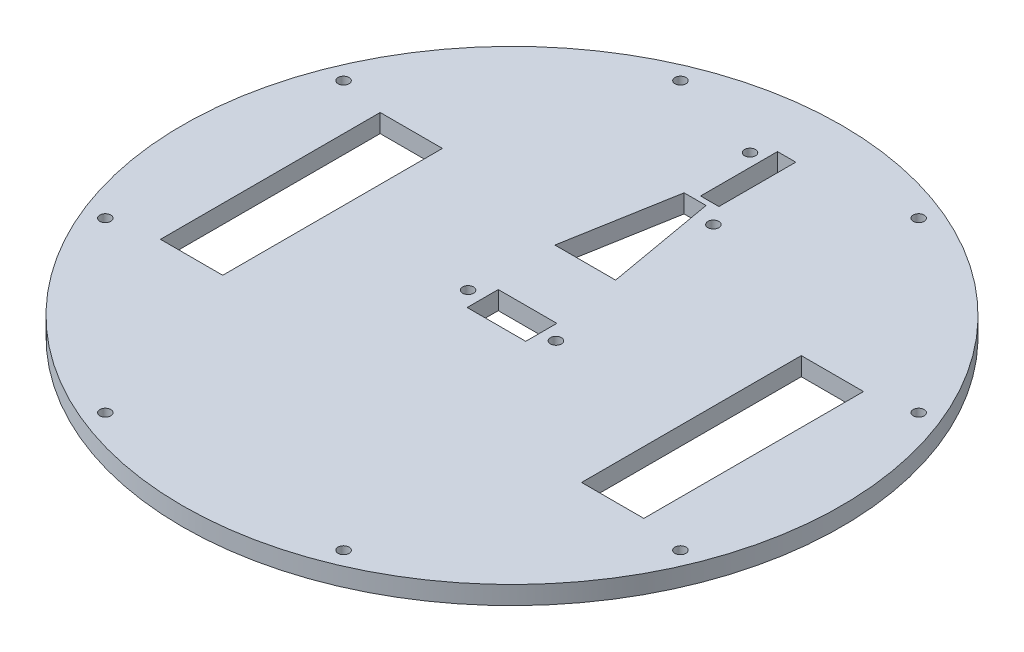
ISO-10303-21;
HEADER;
FILE_DESCRIPTION(('STEP AP214'),'2;1');
FILE_NAME('part.step','',(''),(''),'','','');
FILE_SCHEMA(('AUTOMOTIVE_DESIGN { 1 0 10303 214 1 1 1 1 }'));
ENDSEC;
DATA;
#1=APPLICATION_CONTEXT('core data for automotive mechanical design processes');
#2=APPLICATION_PROTOCOL_DEFINITION('international standard','automotive_design',2000,#1);
#3=PRODUCT_CONTEXT('',#1,'mechanical');
#4=PRODUCT('Part','Part','',(#3));
#5=PRODUCT_RELATED_PRODUCT_CATEGORY('part','',(#4));
#6=PRODUCT_DEFINITION_FORMATION('','',#4);
#7=PRODUCT_DEFINITION_CONTEXT('part definition',#1,'design');
#8=PRODUCT_DEFINITION('design','',#6,#7);
#9=PRODUCT_DEFINITION_SHAPE('','',#8);
#10=(LENGTH_UNIT() NAMED_UNIT(*) SI_UNIT(.MILLI.,.METRE.));
#11=(NAMED_UNIT(*) PLANE_ANGLE_UNIT() SI_UNIT($,.RADIAN.));
#12=(NAMED_UNIT(*) SI_UNIT($,.STERADIAN.) SOLID_ANGLE_UNIT());
#13=UNCERTAINTY_MEASURE_WITH_UNIT(LENGTH_MEASURE(1.E-05),#10,'distance_accuracy_value','');
#14=(GEOMETRIC_REPRESENTATION_CONTEXT(3) GLOBAL_UNCERTAINTY_ASSIGNED_CONTEXT((#13)) GLOBAL_UNIT_ASSIGNED_CONTEXT((#10,
#11,#12)) REPRESENTATION_CONTEXT('',''));
#15=CARTESIAN_POINT('',(0.,0.,0.));
#16=DIRECTION('',(0.,0.,1.));
#17=DIRECTION('',(1.,0.,0.));
#18=AXIS2_PLACEMENT_3D('',#15,#16,#17);
#19=CARTESIAN_POINT('',(0.,5.,0.));
#20=DIRECTION('',(0.,1.,0.));
#21=DIRECTION('',(0.,0.,1.));
#22=AXIS2_PLACEMENT_3D('',#19,#20,#21);
#23=PLANE('',#22);
#24=CARTESIAN_POINT('',(12.,5.,0.));
#25=DIRECTION('',(0.,1.,0.));
#26=DIRECTION('',(0.,0.,1.));
#27=AXIS2_PLACEMENT_3D('',#24,#25,#26);
#28=CIRCLE('',#27,1.5);
#29=CARTESIAN_POINT('',(12.,5.,1.5));
#30=VERTEX_POINT('',#29);
#31=EDGE_CURVE('E831',#30,#30,#28,.T.);
#32=ORIENTED_EDGE('',*,*,#31,.F.);
#33=EDGE_LOOP('',(#32));
#34=FACE_BOUND('',#33,.T.);
#35=CARTESIAN_POINT('',(-12.,5.,0.));
#36=DIRECTION('',(0.,1.,0.));
#37=DIRECTION('',(0.,0.,1.));
#38=AXIS2_PLACEMENT_3D('',#35,#36,#37);
#39=CIRCLE('',#38,1.5);
#40=CARTESIAN_POINT('',(-12.,5.,1.5));
#41=VERTEX_POINT('',#40);
#42=EDGE_CURVE('E829',#41,#41,#39,.T.);
#43=ORIENTED_EDGE('',*,*,#42,.F.);
#44=EDGE_LOOP('',(#43));
#45=FACE_BOUND('',#44,.T.);
#46=DIRECTION('',(0.,0.,-1.));
#47=VECTOR('',#46,1.);
#48=CARTESIAN_POINT('',(8.,5.,4.25));
#49=LINE('',#48,#47);
#50=CARTESIAN_POINT('',(8.,5.,4.25));
#51=VERTEX_POINT('',#50);
#52=CARTESIAN_POINT('',(8.,5.,-4.25));
#53=VERTEX_POINT('',#52);
#54=EDGE_CURVE('E52',#51,#53,#49,.T.);
#55=ORIENTED_EDGE('',*,*,#54,.F.);
#56=DIRECTION('',(1.,0.,0.));
#57=VECTOR('',#56,1.);
#58=CARTESIAN_POINT('',(-8.,5.,4.25));
#59=LINE('',#58,#57);
#60=CARTESIAN_POINT('',(-8.,5.,4.25));
#61=VERTEX_POINT('',#60);
#62=EDGE_CURVE('E192',#61,#51,#59,.T.);
#63=ORIENTED_EDGE('',*,*,#62,.F.);
#64=DIRECTION('',(0.,0.,1.));
#65=VECTOR('',#64,1.);
#66=CARTESIAN_POINT('',(-8.,5.,4.25));
#67=LINE('',#66,#65);
#68=CARTESIAN_POINT('',(-8.,5.,-4.25));
#69=VERTEX_POINT('',#68);
#70=EDGE_CURVE('E177',#69,#61,#67,.T.);
#71=ORIENTED_EDGE('',*,*,#70,.F.);
#72=DIRECTION('',(-1.,0.,0.));
#73=VECTOR('',#72,1.);
#74=CARTESIAN_POINT('',(-8.,5.,-4.25));
#75=LINE('',#74,#73);
#76=EDGE_CURVE('E186',#53,#69,#75,.T.);
#77=ORIENTED_EDGE('',*,*,#76,.F.);
#78=EDGE_LOOP('',(#55,#63,#71,#77));
#79=FACE_BOUND('',#78,.T.);
#80=CARTESIAN_POINT('',(78.5297602634595,5.,-32.5280917510323));
#81=DIRECTION('',(0.,1.,0.));
#82=DIRECTION('',(0.,0.,1.));
#83=AXIS2_PLACEMENT_3D('',#80,#81,#82);
#84=CIRCLE('',#83,1.5);
#85=CARTESIAN_POINT('',(78.5297602634595,5.,-31.0280917510323));
#86=VERTEX_POINT('',#85);
#87=EDGE_CURVE('E212',#86,#86,#84,.T.);
#88=ORIENTED_EDGE('',*,*,#87,.F.);
#89=EDGE_LOOP('',(#88));
#90=FACE_BOUND('',#89,.T.);
#91=CARTESIAN_POINT('',(78.5297602634593,5.,32.5280917510329));
#92=DIRECTION('',(0.,1.,0.));
#93=DIRECTION('',(0.,0.,1.));
#94=AXIS2_PLACEMENT_3D('',#91,#92,#93);
#95=CIRCLE('',#94,1.5);
#96=CARTESIAN_POINT('',(78.5297602634593,5.,34.0280917510329));
#97=VERTEX_POINT('',#96);
#98=EDGE_CURVE('E216',#97,#97,#95,.T.);
#99=ORIENTED_EDGE('',*,*,#98,.F.);
#100=EDGE_LOOP('',(#99));
#101=FACE_BOUND('',#100,.T.);
#102=CARTESIAN_POINT('',(32.5280917510323,5.,78.5297602634595));
#103=DIRECTION('',(0.,1.,0.));
#104=DIRECTION('',(0.,0.,1.));
#105=AXIS2_PLACEMENT_3D('',#102,#103,#104);
#106=CIRCLE('',#105,1.50000000000002);
#107=CARTESIAN_POINT('',(32.5280917510323,5.,80.0297602634595));
#108=VERTEX_POINT('',#107);
#109=EDGE_CURVE('E219',#108,#108,#106,.T.);
#110=ORIENTED_EDGE('',*,*,#109,.F.);
#111=EDGE_LOOP('',(#110));
#112=FACE_BOUND('',#111,.T.);
#113=CARTESIAN_POINT('',(-32.5280917510329,5.,78.5297602634593));
#114=DIRECTION('',(0.,1.,0.));
#115=DIRECTION('',(0.,0.,1.));
#116=AXIS2_PLACEMENT_3D('',#113,#114,#115);
#117=CIRCLE('',#116,1.5);
#118=CARTESIAN_POINT('',(-32.5280917510329,5.,80.0297602634593));
#119=VERTEX_POINT('',#118);
#120=EDGE_CURVE('E205',#119,#119,#117,.T.);
#121=ORIENTED_EDGE('',*,*,#120,.F.);
#122=EDGE_LOOP('',(#121));
#123=FACE_BOUND('',#122,.T.);
#124=CARTESIAN_POINT('',(-78.5297602634595,5.,32.5280917510323));
#125=DIRECTION('',(0.,1.,0.));
#126=DIRECTION('',(0.,0.,1.));
#127=AXIS2_PLACEMENT_3D('',#124,#125,#126);
#128=CIRCLE('',#127,1.5);
#129=CARTESIAN_POINT('',(-78.5297602634595,5.,34.0280917510323));
#130=VERTEX_POINT('',#129);
#131=EDGE_CURVE('E202',#130,#130,#128,.T.);
#132=ORIENTED_EDGE('',*,*,#131,.F.);
#133=EDGE_LOOP('',(#132));
#134=FACE_BOUND('',#133,.T.);
#135=CARTESIAN_POINT('',(-78.5297602634593,5.,-32.5280917510329));
#136=DIRECTION('',(0.,1.,0.));
#137=DIRECTION('',(0.,0.,1.));
#138=AXIS2_PLACEMENT_3D('',#135,#136,#137);
#139=CIRCLE('',#138,1.50000000000001);
#140=CARTESIAN_POINT('',(-78.5297602634593,5.,-31.0280917510329));
#141=VERTEX_POINT('',#140);
#142=EDGE_CURVE('E206',#141,#141,#139,.T.);
#143=ORIENTED_EDGE('',*,*,#142,.F.);
#144=EDGE_LOOP('',(#143));
#145=FACE_BOUND('',#144,.T.);
#146=CARTESIAN_POINT('',(-32.5280917510323,5.,-78.5297602634595));
#147=DIRECTION('',(0.,1.,0.));
#148=DIRECTION('',(0.,0.,1.));
#149=AXIS2_PLACEMENT_3D('',#146,#147,#148);
#150=CIRCLE('',#149,1.5);
#151=CARTESIAN_POINT('',(-32.5280917510323,5.,-77.0297602634595));
#152=VERTEX_POINT('',#151);
#153=EDGE_CURVE('E209',#152,#152,#150,.T.);
#154=ORIENTED_EDGE('',*,*,#153,.F.);
#155=EDGE_LOOP('',(#154));
#156=FACE_BOUND('',#155,.T.);
#157=CARTESIAN_POINT('',(32.528091751033,5.,-78.5297602634592));
#158=DIRECTION('',(0.,1.,0.));
#159=DIRECTION('',(0.,0.,1.));
#160=AXIS2_PLACEMENT_3D('',#157,#158,#159);
#161=CIRCLE('',#160,1.5);
#162=CARTESIAN_POINT('',(32.528091751033,5.,-77.0297602634592));
#163=VERTEX_POINT('',#162);
#164=EDGE_CURVE('E215',#163,#163,#161,.T.);
#165=ORIENTED_EDGE('',*,*,#164,.F.);
#166=EDGE_LOOP('',(#165));
#167=FACE_BOUND('',#166,.T.);
#168=CARTESIAN_POINT('',(-6.,5.,-71.));
#169=DIRECTION('',(0.,1.,0.));
#170=DIRECTION('',(0.,0.,1.));
#171=AXIS2_PLACEMENT_3D('',#168,#169,#170);
#172=CIRCLE('',#171,1.5);
#173=CARTESIAN_POINT('',(-6.,5.,-69.5));
#174=VERTEX_POINT('',#173);
#175=EDGE_CURVE('E266',#174,#174,#172,.T.);
#176=ORIENTED_EDGE('',*,*,#175,.F.);
#177=EDGE_LOOP('',(#176));
#178=FACE_BOUND('',#177,.T.);
#179=CARTESIAN_POINT('',(0.,5.,0.));
#180=DIRECTION('',(0.,1.,0.));
#181=DIRECTION('',(0.,0.,1.));
#182=AXIS2_PLACEMENT_3D('',#179,#180,#181);
#183=CIRCLE('',#182,90.);
#184=CARTESIAN_POINT('',(0.,5.,90.));
#185=VERTEX_POINT('',#184);
#186=EDGE_CURVE('E365',#185,#185,#183,.T.);
#187=ORIENTED_EDGE('',*,*,#186,.T.);
#188=EDGE_LOOP('',(#187));
#189=FACE_BOUND('',#188,.T.);
#190=DIRECTION('',(1.,0.,0.));
#191=VECTOR('',#190,1.);
#192=CARTESIAN_POINT('',(-49.,5.,30.));
#193=LINE('',#192,#191);
#194=CARTESIAN_POINT('',(-66.,5.,30.));
#195=VERTEX_POINT('',#194);
#196=CARTESIAN_POINT('',(-49.,5.,30.));
#197=VERTEX_POINT('',#196);
#198=EDGE_CURVE('E336',#195,#197,#193,.T.);
#199=ORIENTED_EDGE('',*,*,#198,.F.);
#200=DIRECTION('',(0.,0.,1.));
#201=VECTOR('',#200,1.);
#202=CARTESIAN_POINT('',(-66.,5.,30.));
#203=LINE('',#202,#201);
#204=CARTESIAN_POINT('',(-66.,5.,-30.));
#205=VERTEX_POINT('',#204);
#206=EDGE_CURVE('E334',#205,#195,#203,.T.);
#207=ORIENTED_EDGE('',*,*,#206,.F.);
#208=DIRECTION('',(-1.,0.,0.));
#209=VECTOR('',#208,1.);
#210=CARTESIAN_POINT('',(-49.,5.,-30.));
#211=LINE('',#210,#209);
#212=CARTESIAN_POINT('',(-49.,5.,-30.));
#213=VERTEX_POINT('',#212);
#214=EDGE_CURVE('E342',#213,#205,#211,.T.);
#215=ORIENTED_EDGE('',*,*,#214,.F.);
#216=DIRECTION('',(0.,0.,-1.));
#217=VECTOR('',#216,1.);
#218=CARTESIAN_POINT('',(-49.,5.,30.));
#219=LINE('',#218,#217);
#220=EDGE_CURVE('E339',#197,#213,#219,.T.);
#221=ORIENTED_EDGE('',*,*,#220,.F.);
#222=EDGE_LOOP('',(#199,#207,#215,#221));
#223=FACE_BOUND('',#222,.T.);
#224=DIRECTION('',(1.,0.,0.));
#225=VECTOR('',#224,1.);
#226=CARTESIAN_POINT('',(49.,5.,30.));
#227=LINE('',#226,#225);
#228=CARTESIAN_POINT('',(49.,5.,30.));
#229=VERTEX_POINT('',#228);
#230=CARTESIAN_POINT('',(66.,5.,30.));
#231=VERTEX_POINT('',#230);
#232=EDGE_CURVE('E305',#229,#231,#227,.T.);
#233=ORIENTED_EDGE('',*,*,#232,.F.);
#234=DIRECTION('',(0.,0.,1.));
#235=VECTOR('',#234,1.);
#236=CARTESIAN_POINT('',(49.,5.,30.));
#237=LINE('',#236,#235);
#238=CARTESIAN_POINT('',(49.,5.,-30.));
#239=VERTEX_POINT('',#238);
#240=EDGE_CURVE('E303',#239,#229,#237,.T.);
#241=ORIENTED_EDGE('',*,*,#240,.F.);
#242=DIRECTION('',(-1.,0.,0.));
#243=VECTOR('',#242,1.);
#244=CARTESIAN_POINT('',(49.,5.,-30.));
#245=LINE('',#244,#243);
#246=CARTESIAN_POINT('',(66.,5.,-30.));
#247=VERTEX_POINT('',#246);
#248=EDGE_CURVE('E311',#247,#239,#245,.T.);
#249=ORIENTED_EDGE('',*,*,#248,.F.);
#250=DIRECTION('',(0.,0.,-1.));
#251=VECTOR('',#250,1.);
#252=CARTESIAN_POINT('',(66.,5.,30.));
#253=LINE('',#252,#251);
#254=EDGE_CURVE('E308',#231,#247,#253,.T.);
#255=ORIENTED_EDGE('',*,*,#254,.F.);
#256=EDGE_LOOP('',(#233,#241,#249,#255));
#257=FACE_BOUND('',#256,.T.);
#258=DIRECTION('',(-1.,0.,0.));
#259=VECTOR('',#258,1.);
#260=CARTESIAN_POINT('',(-2.5,5.,-75.));
#261=LINE('',#260,#259);
#262=CARTESIAN_POINT('',(2.5,5.,-75.));
#263=VERTEX_POINT('',#262);
#264=CARTESIAN_POINT('',(-2.5,5.,-75.));
#265=VERTEX_POINT('',#264);
#266=EDGE_CURVE('E274',#263,#265,#261,.T.);
#267=ORIENTED_EDGE('',*,*,#266,.F.);
#268=DIRECTION('',(0.,0.,-1.));
#269=VECTOR('',#268,1.);
#270=CARTESIAN_POINT('',(2.5,5.,-54.));
#271=LINE('',#270,#269);
#272=CARTESIAN_POINT('',(2.5,5.,-54.));
#273=VERTEX_POINT('',#272);
#274=EDGE_CURVE('E272',#273,#263,#271,.T.);
#275=ORIENTED_EDGE('',*,*,#274,.F.);
#276=DIRECTION('',(1.,0.,0.));
#277=VECTOR('',#276,1.);
#278=CARTESIAN_POINT('',(-2.5,5.,-54.));
#279=LINE('',#278,#277);
#280=CARTESIAN_POINT('',(-2.5,5.,-54.));
#281=VERTEX_POINT('',#280);
#282=EDGE_CURVE('E280',#281,#273,#279,.T.);
#283=ORIENTED_EDGE('',*,*,#282,.F.);
#284=DIRECTION('',(0.,0.,1.));
#285=VECTOR('',#284,1.);
#286=CARTESIAN_POINT('',(-2.5,5.,-54.));
#287=LINE('',#286,#285);
#288=EDGE_CURVE('E277',#265,#281,#287,.T.);
#289=ORIENTED_EDGE('',*,*,#288,.F.);
#290=EDGE_LOOP('',(#267,#275,#283,#289));
#291=FACE_BOUND('',#290,.T.);
#292=CARTESIAN_POINT('',(6.00000000000001,5.,-49.));
#293=DIRECTION('',(0.,1.,0.));
#294=DIRECTION('',(0.,0.,1.));
#295=AXIS2_PLACEMENT_3D('',#292,#293,#294);
#296=CIRCLE('',#295,1.5);
#297=CARTESIAN_POINT('',(6.00000000000001,5.,-47.5));
#298=VERTEX_POINT('',#297);
#299=EDGE_CURVE('E260',#298,#298,#296,.T.);
#300=ORIENTED_EDGE('',*,*,#299,.F.);
#301=EDGE_LOOP('',(#300));
#302=FACE_BOUND('',#301,.T.);
#303=DIRECTION('',(-1.,0.,0.));
#304=VECTOR('',#303,1.);
#305=CARTESIAN_POINT('',(-5.49999999999999,5.,-52.5));
#306=LINE('',#305,#304);
#307=CARTESIAN_POINT('',(0.500000000000005,5.,-52.5));
#308=VERTEX_POINT('',#307);
#309=CARTESIAN_POINT('',(-5.49999999999999,5.,-52.5));
#310=VERTEX_POINT('',#309);
#311=EDGE_CURVE('E229',#308,#310,#306,.T.);
#312=ORIENTED_EDGE('',*,*,#311,.F.);
#313=DIRECTION('',(-0.173648177666931,0.,-0.984807753012208));
#314=VECTOR('',#313,1.);
#315=CARTESIAN_POINT('',(0.500000000000005,5.,-52.5));
#316=LINE('',#315,#314);
#317=CARTESIAN_POINT('',(5.78980942125399,5.,-22.5));
#318=VERTEX_POINT('',#317);
#319=EDGE_CURVE('E227',#318,#308,#316,.T.);
#320=ORIENTED_EDGE('',*,*,#319,.F.);
#321=DIRECTION('',(1.,0.,0.));
#322=VECTOR('',#321,1.);
#323=CARTESIAN_POINT('',(5.78980942125399,5.,-22.5));
#324=LINE('',#323,#322);
#325=CARTESIAN_POINT('',(-10.789809421254,5.,-22.5));
#326=VERTEX_POINT('',#325);
#327=EDGE_CURVE('E235',#326,#318,#324,.T.);
#328=ORIENTED_EDGE('',*,*,#327,.F.);
#329=DIRECTION('',(-0.173648177666931,0.,0.984807753012208));
#330=VECTOR('',#329,1.);
#331=CARTESIAN_POINT('',(-5.49999999999999,5.,-52.5));
#332=LINE('',#331,#330);
#333=EDGE_CURVE('E232',#310,#326,#332,.T.);
#334=ORIENTED_EDGE('',*,*,#333,.F.);
#335=EDGE_LOOP('',(#312,#320,#328,#334));
#336=FACE_BOUND('',#335,.T.);
#337=ADVANCED_FACE('F35',(#34,#45,#79,#90,#101,#112,#123,#134,#145,#156,#167,#178,#189,#223,
#257,#291,#302,#336),#23,.T.);
#338=CARTESIAN_POINT('',(0.,0.,0.));
#339=DIRECTION('',(0.,1.,0.));
#340=DIRECTION('',(0.,0.,1.));
#341=AXIS2_PLACEMENT_3D('',#338,#339,#340);
#342=PLANE('',#341);
#343=CARTESIAN_POINT('',(12.,0.,0.));
#344=DIRECTION('',(0.,1.,0.));
#345=DIRECTION('',(0.,0.,1.));
#346=AXIS2_PLACEMENT_3D('',#343,#344,#345);
#347=CIRCLE('',#346,1.5);
#348=CARTESIAN_POINT('',(12.,0.,1.5));
#349=VERTEX_POINT('',#348);
#350=EDGE_CURVE('E39',#349,#349,#347,.T.);
#351=ORIENTED_EDGE('',*,*,#350,.T.);
#352=EDGE_LOOP('',(#351));
#353=FACE_BOUND('',#352,.T.);
#354=CARTESIAN_POINT('',(-12.,0.,0.));
#355=DIRECTION('',(0.,1.,0.));
#356=DIRECTION('',(0.,0.,1.));
#357=AXIS2_PLACEMENT_3D('',#354,#355,#356);
#358=CIRCLE('',#357,1.5);
#359=CARTESIAN_POINT('',(-12.,0.,1.5));
#360=VERTEX_POINT('',#359);
#361=EDGE_CURVE('E199',#360,#360,#358,.T.);
#362=ORIENTED_EDGE('',*,*,#361,.T.);
#363=EDGE_LOOP('',(#362));
#364=FACE_BOUND('',#363,.T.);
#365=DIRECTION('',(1.,0.,0.));
#366=VECTOR('',#365,1.);
#367=CARTESIAN_POINT('',(0.,0.,4.25));
#368=LINE('',#367,#366);
#369=CARTESIAN_POINT('',(-8.,0.,4.25));
#370=VERTEX_POINT('',#369);
#371=CARTESIAN_POINT('',(8.,0.,4.25));
#372=VERTEX_POINT('',#371);
#373=EDGE_CURVE('E44',#370,#372,#368,.T.);
#374=ORIENTED_EDGE('',*,*,#373,.T.);
#375=DIRECTION('',(0.,0.,-1.));
#376=VECTOR('',#375,1.);
#377=CARTESIAN_POINT('',(8.,0.,0.));
#378=LINE('',#377,#376);
#379=CARTESIAN_POINT('',(8.,0.,-4.25));
#380=VERTEX_POINT('',#379);
#381=EDGE_CURVE('E11',#372,#380,#378,.T.);
#382=ORIENTED_EDGE('',*,*,#381,.T.);
#383=DIRECTION('',(-1.,0.,0.));
#384=VECTOR('',#383,1.);
#385=CARTESIAN_POINT('',(0.,0.,-4.25));
#386=LINE('',#385,#384);
#387=CARTESIAN_POINT('',(-8.,0.,-4.25));
#388=VERTEX_POINT('',#387);
#389=EDGE_CURVE('E368',#380,#388,#386,.T.);
#390=ORIENTED_EDGE('',*,*,#389,.T.);
#391=DIRECTION('',(0.,0.,1.));
#392=VECTOR('',#391,1.);
#393=CARTESIAN_POINT('',(-8.,0.,0.));
#394=LINE('',#393,#392);
#395=EDGE_CURVE('E180',#388,#370,#394,.T.);
#396=ORIENTED_EDGE('',*,*,#395,.T.);
#397=EDGE_LOOP('',(#374,#382,#390,#396));
#398=FACE_BOUND('',#397,.T.);
#399=CARTESIAN_POINT('',(78.5297602634595,0.,-32.5280917510323));
#400=DIRECTION('',(0.,1.,0.));
#401=DIRECTION('',(0.,0.,1.));
#402=AXIS2_PLACEMENT_3D('',#399,#400,#401);
#403=CIRCLE('',#402,1.5);
#404=CARTESIAN_POINT('',(78.5297602634595,0.,-31.0280917510323));
#405=VERTEX_POINT('',#404);
#406=EDGE_CURVE('E242',#405,#405,#403,.T.);
#407=ORIENTED_EDGE('',*,*,#406,.T.);
#408=EDGE_LOOP('',(#407));
#409=FACE_BOUND('',#408,.T.);
#410=CARTESIAN_POINT('',(78.5297602634593,0.,32.5280917510329));
#411=DIRECTION('',(0.,1.,0.));
#412=DIRECTION('',(0.,0.,1.));
#413=AXIS2_PLACEMENT_3D('',#410,#411,#412);
#414=CIRCLE('',#413,1.5);
#415=CARTESIAN_POINT('',(78.5297602634593,0.,34.0280917510329));
#416=VERTEX_POINT('',#415);
#417=EDGE_CURVE('E388',#416,#416,#414,.T.);
#418=ORIENTED_EDGE('',*,*,#417,.T.);
#419=EDGE_LOOP('',(#418));
#420=FACE_BOUND('',#419,.T.);
#421=CARTESIAN_POINT('',(32.5280917510323,0.,78.5297602634595));
#422=DIRECTION('',(0.,1.,0.));
#423=DIRECTION('',(0.,0.,1.));
#424=AXIS2_PLACEMENT_3D('',#421,#422,#423);
#425=CIRCLE('',#424,1.50000000000002);
#426=CARTESIAN_POINT('',(32.5280917510323,0.,80.0297602634595));
#427=VERTEX_POINT('',#426);
#428=EDGE_CURVE('E385',#427,#427,#425,.T.);
#429=ORIENTED_EDGE('',*,*,#428,.T.);
#430=EDGE_LOOP('',(#429));
#431=FACE_BOUND('',#430,.T.);
#432=CARTESIAN_POINT('',(-32.5280917510329,0.,78.5297602634593));
#433=DIRECTION('',(0.,1.,0.));
#434=DIRECTION('',(0.,0.,1.));
#435=AXIS2_PLACEMENT_3D('',#432,#433,#434);
#436=CIRCLE('',#435,1.5);
#437=CARTESIAN_POINT('',(-32.5280917510329,0.,80.0297602634593));
#438=VERTEX_POINT('',#437);
#439=EDGE_CURVE('E382',#438,#438,#436,.T.);
#440=ORIENTED_EDGE('',*,*,#439,.T.);
#441=EDGE_LOOP('',(#440));
#442=FACE_BOUND('',#441,.T.);
#443=CARTESIAN_POINT('',(-78.5297602634595,0.,32.5280917510323));
#444=DIRECTION('',(0.,1.,0.));
#445=DIRECTION('',(0.,0.,1.));
#446=AXIS2_PLACEMENT_3D('',#443,#444,#445);
#447=CIRCLE('',#446,1.5);
#448=CARTESIAN_POINT('',(-78.5297602634595,0.,34.0280917510323));
#449=VERTEX_POINT('',#448);
#450=EDGE_CURVE('E379',#449,#449,#447,.T.);
#451=ORIENTED_EDGE('',*,*,#450,.T.);
#452=EDGE_LOOP('',(#451));
#453=FACE_BOUND('',#452,.T.);
#454=CARTESIAN_POINT('',(-78.5297602634593,0.,-32.5280917510329));
#455=DIRECTION('',(0.,1.,0.));
#456=DIRECTION('',(0.,0.,1.));
#457=AXIS2_PLACEMENT_3D('',#454,#455,#456);
#458=CIRCLE('',#457,1.50000000000001);
#459=CARTESIAN_POINT('',(-78.5297602634593,0.,-31.0280917510329));
#460=VERTEX_POINT('',#459);
#461=EDGE_CURVE('E376',#460,#460,#458,.T.);
#462=ORIENTED_EDGE('',*,*,#461,.T.);
#463=EDGE_LOOP('',(#462));
#464=FACE_BOUND('',#463,.T.);
#465=CARTESIAN_POINT('',(-32.5280917510323,0.,-78.5297602634595));
#466=DIRECTION('',(0.,1.,0.));
#467=DIRECTION('',(0.,0.,1.));
#468=AXIS2_PLACEMENT_3D('',#465,#466,#467);
#469=CIRCLE('',#468,1.5);
#470=CARTESIAN_POINT('',(-32.5280917510323,0.,-77.0297602634595));
#471=VERTEX_POINT('',#470);
#472=EDGE_CURVE('E373',#471,#471,#469,.T.);
#473=ORIENTED_EDGE('',*,*,#472,.T.);
#474=EDGE_LOOP('',(#473));
#475=FACE_BOUND('',#474,.T.);
#476=CARTESIAN_POINT('',(32.528091751033,0.,-78.5297602634592));
#477=DIRECTION('',(0.,1.,0.));
#478=DIRECTION('',(0.,0.,1.));
#479=AXIS2_PLACEMENT_3D('',#476,#477,#478);
#480=CIRCLE('',#479,1.5);
#481=CARTESIAN_POINT('',(32.528091751033,0.,-77.0297602634592));
#482=VERTEX_POINT('',#481);
#483=EDGE_CURVE('E226',#482,#482,#480,.T.);
#484=ORIENTED_EDGE('',*,*,#483,.T.);
#485=EDGE_LOOP('',(#484));
#486=FACE_BOUND('',#485,.T.);
#487=CARTESIAN_POINT('',(6.00000000000001,0.,-49.));
#488=DIRECTION('',(0.,1.,0.));
#489=DIRECTION('',(0.,0.,1.));
#490=AXIS2_PLACEMENT_3D('',#487,#488,#489);
#491=CIRCLE('',#490,1.5);
#492=CARTESIAN_POINT('',(6.00000000000001,0.,-47.5));
#493=VERTEX_POINT('',#492);
#494=EDGE_CURVE('E259',#493,#493,#491,.T.);
#495=ORIENTED_EDGE('',*,*,#494,.T.);
#496=EDGE_LOOP('',(#495));
#497=FACE_BOUND('',#496,.T.);
#498=CARTESIAN_POINT('',(-6.,0.,-71.));
#499=DIRECTION('',(0.,1.,0.));
#500=DIRECTION('',(0.,0.,1.));
#501=AXIS2_PLACEMENT_3D('',#498,#499,#500);
#502=CIRCLE('',#501,1.5);
#503=CARTESIAN_POINT('',(-6.,0.,-69.5));
#504=VERTEX_POINT('',#503);
#505=EDGE_CURVE('E263',#504,#504,#502,.T.);
#506=ORIENTED_EDGE('',*,*,#505,.T.);
#507=EDGE_LOOP('',(#506));
#508=FACE_BOUND('',#507,.T.);
#509=DIRECTION('',(0.,0.,-1.));
#510=VECTOR('',#509,1.);
#511=CARTESIAN_POINT('',(2.5,0.,-54.));
#512=LINE('',#511,#510);
#513=CARTESIAN_POINT('',(2.5,0.,-54.));
#514=VERTEX_POINT('',#513);
#515=CARTESIAN_POINT('',(2.5,0.,-75.));
#516=VERTEX_POINT('',#515);
#517=EDGE_CURVE('E269',#514,#516,#512,.T.);
#518=ORIENTED_EDGE('',*,*,#517,.T.);
#519=DIRECTION('',(-1.,0.,0.));
#520=VECTOR('',#519,1.);
#521=CARTESIAN_POINT('',(-2.5,0.,-75.));
#522=LINE('',#521,#520);
#523=CARTESIAN_POINT('',(-2.5,0.,-75.));
#524=VERTEX_POINT('',#523);
#525=EDGE_CURVE('E285',#516,#524,#522,.T.);
#526=ORIENTED_EDGE('',*,*,#525,.T.);
#527=DIRECTION('',(0.,0.,1.));
#528=VECTOR('',#527,1.);
#529=CARTESIAN_POINT('',(-2.5,0.,-54.));
#530=LINE('',#529,#528);
#531=CARTESIAN_POINT('',(-2.5,0.,-54.));
#532=VERTEX_POINT('',#531);
#533=EDGE_CURVE('E288',#524,#532,#530,.T.);
#534=ORIENTED_EDGE('',*,*,#533,.T.);
#535=DIRECTION('',(1.,0.,0.));
#536=VECTOR('',#535,1.);
#537=CARTESIAN_POINT('',(-2.5,0.,-54.));
#538=LINE('',#537,#536);
#539=EDGE_CURVE('E275',#532,#514,#538,.T.);
#540=ORIENTED_EDGE('',*,*,#539,.T.);
#541=EDGE_LOOP('',(#518,#526,#534,#540));
#542=FACE_BOUND('',#541,.T.);
#543=DIRECTION('',(0.,0.,1.));
#544=VECTOR('',#543,1.);
#545=CARTESIAN_POINT('',(-66.,0.,30.));
#546=LINE('',#545,#544);
#547=CARTESIAN_POINT('',(-66.,0.,-30.));
#548=VERTEX_POINT('',#547);
#549=CARTESIAN_POINT('',(-66.,0.,30.));
#550=VERTEX_POINT('',#549);
#551=EDGE_CURVE('E333',#548,#550,#546,.T.);
#552=ORIENTED_EDGE('',*,*,#551,.T.);
#553=DIRECTION('',(1.,0.,0.));
#554=VECTOR('',#553,1.);
#555=CARTESIAN_POINT('',(-49.,0.,30.));
#556=LINE('',#555,#554);
#557=CARTESIAN_POINT('',(-49.,0.,30.));
#558=VERTEX_POINT('',#557);
#559=EDGE_CURVE('E347',#550,#558,#556,.T.);
#560=ORIENTED_EDGE('',*,*,#559,.T.);
#561=DIRECTION('',(0.,0.,-1.));
#562=VECTOR('',#561,1.);
#563=CARTESIAN_POINT('',(-49.,0.,30.));
#564=LINE('',#563,#562);
#565=CARTESIAN_POINT('',(-49.,0.,-30.));
#566=VERTEX_POINT('',#565);
#567=EDGE_CURVE('E350',#558,#566,#564,.T.);
#568=ORIENTED_EDGE('',*,*,#567,.T.);
#569=DIRECTION('',(-1.,0.,0.));
#570=VECTOR('',#569,1.);
#571=CARTESIAN_POINT('',(-49.,0.,-30.));
#572=LINE('',#571,#570);
#573=EDGE_CURVE('E337',#566,#548,#572,.T.);
#574=ORIENTED_EDGE('',*,*,#573,.T.);
#575=EDGE_LOOP('',(#552,#560,#568,#574));
#576=FACE_BOUND('',#575,.T.);
#577=CARTESIAN_POINT('',(0.,0.,0.));
#578=DIRECTION('',(0.,1.,0.));
#579=DIRECTION('',(0.,0.,1.));
#580=AXIS2_PLACEMENT_3D('',#577,#578,#579);
#581=CIRCLE('',#580,90.);
#582=CARTESIAN_POINT('',(0.,0.,90.));
#583=VERTEX_POINT('',#582);
#584=EDGE_CURVE('E364',#583,#583,#581,.T.);
#585=ORIENTED_EDGE('',*,*,#584,.F.);
#586=EDGE_LOOP('',(#585));
#587=FACE_BOUND('',#586,.T.);
#588=DIRECTION('',(0.,0.,1.));
#589=VECTOR('',#588,1.);
#590=CARTESIAN_POINT('',(49.,0.,30.));
#591=LINE('',#590,#589);
#592=CARTESIAN_POINT('',(49.,0.,-30.));
#593=VERTEX_POINT('',#592);
#594=CARTESIAN_POINT('',(49.,0.,30.));
#595=VERTEX_POINT('',#594);
#596=EDGE_CURVE('E302',#593,#595,#591,.T.);
#597=ORIENTED_EDGE('',*,*,#596,.T.);
#598=DIRECTION('',(1.,0.,0.));
#599=VECTOR('',#598,1.);
#600=CARTESIAN_POINT('',(49.,0.,30.));
#601=LINE('',#600,#599);
#602=CARTESIAN_POINT('',(66.,0.,30.));
#603=VERTEX_POINT('',#602);
#604=EDGE_CURVE('E316',#595,#603,#601,.T.);
#605=ORIENTED_EDGE('',*,*,#604,.T.);
#606=DIRECTION('',(0.,0.,-1.));
#607=VECTOR('',#606,1.);
#608=CARTESIAN_POINT('',(66.,0.,30.));
#609=LINE('',#608,#607);
#610=CARTESIAN_POINT('',(66.,0.,-30.));
#611=VERTEX_POINT('',#610);
#612=EDGE_CURVE('E319',#603,#611,#609,.T.);
#613=ORIENTED_EDGE('',*,*,#612,.T.);
#614=DIRECTION('',(-1.,0.,0.));
#615=VECTOR('',#614,1.);
#616=CARTESIAN_POINT('',(49.,0.,-30.));
#617=LINE('',#616,#615);
#618=EDGE_CURVE('E306',#611,#593,#617,.T.);
#619=ORIENTED_EDGE('',*,*,#618,.T.);
#620=EDGE_LOOP('',(#597,#605,#613,#619));
#621=FACE_BOUND('',#620,.T.);
#622=DIRECTION('',(-0.173648177666931,0.,-0.984807753012208));
#623=VECTOR('',#622,1.);
#624=CARTESIAN_POINT('',(0.500000000000005,0.,-52.5));
#625=LINE('',#624,#623);
#626=CARTESIAN_POINT('',(5.78980942125399,0.,-22.5));
#627=VERTEX_POINT('',#626);
#628=CARTESIAN_POINT('',(0.500000000000005,0.,-52.5));
#629=VERTEX_POINT('',#628);
#630=EDGE_CURVE('E238',#627,#629,#625,.T.);
#631=ORIENTED_EDGE('',*,*,#630,.T.);
#632=DIRECTION('',(-1.,0.,0.));
#633=VECTOR('',#632,1.);
#634=CARTESIAN_POINT('',(-5.49999999999999,0.,-52.5));
#635=LINE('',#634,#633);
#636=CARTESIAN_POINT('',(-5.49999999999999,0.,-52.5));
#637=VERTEX_POINT('',#636);
#638=EDGE_CURVE('E241',#629,#637,#635,.T.);
#639=ORIENTED_EDGE('',*,*,#638,.T.);
#640=DIRECTION('',(-0.173648177666931,0.,0.984807753012208));
#641=VECTOR('',#640,1.);
#642=CARTESIAN_POINT('',(-5.49999999999999,0.,-52.5));
#643=LINE('',#642,#641);
#644=CARTESIAN_POINT('',(-10.789809421254,0.,-22.5));
#645=VERTEX_POINT('',#644);
#646=EDGE_CURVE('E245',#637,#645,#643,.T.);
#647=ORIENTED_EDGE('',*,*,#646,.T.);
#648=DIRECTION('',(1.,0.,0.));
#649=VECTOR('',#648,1.);
#650=CARTESIAN_POINT('',(5.78980942125399,0.,-22.5));
#651=LINE('',#650,#649);
#652=EDGE_CURVE('E230',#645,#627,#651,.T.);
#653=ORIENTED_EDGE('',*,*,#652,.T.);
#654=EDGE_LOOP('',(#631,#639,#647,#653));
#655=FACE_BOUND('',#654,.T.);
#656=ADVANCED_FACE('F402',(#353,#364,#398,#409,#420,#431,#442,#453,#464,#475,#486,#497,#508,
#542,#576,#587,#621,#655),#342,.F.);
#657=CARTESIAN_POINT('',(0.,5.,0.));
#658=DIRECTION('',(0.,-1.,0.));
#659=DIRECTION('',(0.,0.,-1.));
#660=AXIS2_PLACEMENT_3D('',#657,#658,#659);
#661=CYLINDRICAL_SURFACE('',#660,90.);
#662=ORIENTED_EDGE('',*,*,#186,.F.);
#663=EDGE_LOOP('',(#662));
#664=FACE_BOUND('',#663,.T.);
#665=ORIENTED_EDGE('',*,*,#584,.T.);
#666=EDGE_LOOP('',(#665));
#667=FACE_BOUND('',#666,.T.);
#668=ADVANCED_FACE('F37',(#664,#667),#661,.T.);
#669=CARTESIAN_POINT('',(-66.,5.,30.));
#670=DIRECTION('',(1.,0.,0.));
#671=DIRECTION('',(0.,0.,-1.));
#672=AXIS2_PLACEMENT_3D('',#669,#670,#671);
#673=PLANE('',#672);
#674=ORIENTED_EDGE('',*,*,#551,.F.);
#675=DIRECTION('',(0.,-1.,0.));
#676=VECTOR('',#675,1.);
#677=CARTESIAN_POINT('',(-66.,5.,-30.));
#678=LINE('',#677,#676);
#679=EDGE_CURVE('E344',#205,#548,#678,.T.);
#680=ORIENTED_EDGE('',*,*,#679,.F.);
#681=ORIENTED_EDGE('',*,*,#206,.T.);
#682=DIRECTION('',(0.,-1.,0.));
#683=VECTOR('',#682,1.);
#684=CARTESIAN_POINT('',(-66.,5.,30.));
#685=LINE('',#684,#683);
#686=EDGE_CURVE('E361',#195,#550,#685,.T.);
#687=ORIENTED_EDGE('',*,*,#686,.T.);
#688=EDGE_LOOP('',(#674,#680,#681,#687));
#689=FACE_BOUND('',#688,.T.);
#690=ADVANCED_FACE('F425',(#689),#673,.T.);
#691=CARTESIAN_POINT('',(-49.,5.,30.));
#692=DIRECTION('',(0.,0.,-1.));
#693=DIRECTION('',(-1.,0.,0.));
#694=AXIS2_PLACEMENT_3D('',#691,#692,#693);
#695=PLANE('',#694);
#696=ORIENTED_EDGE('',*,*,#559,.F.);
#697=ORIENTED_EDGE('',*,*,#686,.F.);
#698=ORIENTED_EDGE('',*,*,#198,.T.);
#699=DIRECTION('',(0.,-1.,0.));
#700=VECTOR('',#699,1.);
#701=CARTESIAN_POINT('',(-49.,5.,30.));
#702=LINE('',#701,#700);
#703=EDGE_CURVE('E359',#197,#558,#702,.T.);
#704=ORIENTED_EDGE('',*,*,#703,.T.);
#705=EDGE_LOOP('',(#696,#697,#698,#704));
#706=FACE_BOUND('',#705,.T.);
#707=ADVANCED_FACE('F428',(#706),#695,.T.);
#708=CARTESIAN_POINT('',(-49.,5.,30.));
#709=DIRECTION('',(-1.,0.,0.));
#710=DIRECTION('',(0.,0.,1.));
#711=AXIS2_PLACEMENT_3D('',#708,#709,#710);
#712=PLANE('',#711);
#713=ORIENTED_EDGE('',*,*,#567,.F.);
#714=ORIENTED_EDGE('',*,*,#703,.F.);
#715=ORIENTED_EDGE('',*,*,#220,.T.);
#716=DIRECTION('',(0.,-1.,0.));
#717=VECTOR('',#716,1.);
#718=CARTESIAN_POINT('',(-49.,5.,-30.));
#719=LINE('',#718,#717);
#720=EDGE_CURVE('E357',#213,#566,#719,.T.);
#721=ORIENTED_EDGE('',*,*,#720,.T.);
#722=EDGE_LOOP('',(#713,#714,#715,#721));
#723=FACE_BOUND('',#722,.T.);
#724=ADVANCED_FACE('F432',(#723),#712,.T.);
#725=CARTESIAN_POINT('',(-49.,5.,-30.));
#726=DIRECTION('',(0.,0.,1.));
#727=DIRECTION('',(1.,0.,0.));
#728=AXIS2_PLACEMENT_3D('',#725,#726,#727);
#729=PLANE('',#728);
#730=ORIENTED_EDGE('',*,*,#573,.F.);
#731=ORIENTED_EDGE('',*,*,#720,.F.);
#732=ORIENTED_EDGE('',*,*,#214,.T.);
#733=ORIENTED_EDGE('',*,*,#679,.T.);
#734=EDGE_LOOP('',(#730,#731,#732,#733));
#735=FACE_BOUND('',#734,.T.);
#736=ADVANCED_FACE('F436',(#735),#729,.T.);
#737=CARTESIAN_POINT('',(49.,5.,30.));
#738=DIRECTION('',(1.,0.,0.));
#739=DIRECTION('',(0.,0.,-1.));
#740=AXIS2_PLACEMENT_3D('',#737,#738,#739);
#741=PLANE('',#740);
#742=ORIENTED_EDGE('',*,*,#596,.F.);
#743=DIRECTION('',(0.,-1.,0.));
#744=VECTOR('',#743,1.);
#745=CARTESIAN_POINT('',(49.,5.,-30.));
#746=LINE('',#745,#744);
#747=EDGE_CURVE('E313',#239,#593,#746,.T.);
#748=ORIENTED_EDGE('',*,*,#747,.F.);
#749=ORIENTED_EDGE('',*,*,#240,.T.);
#750=DIRECTION('',(0.,-1.,0.));
#751=VECTOR('',#750,1.);
#752=CARTESIAN_POINT('',(49.,5.,30.));
#753=LINE('',#752,#751);
#754=EDGE_CURVE('E330',#229,#595,#753,.T.);
#755=ORIENTED_EDGE('',*,*,#754,.T.);
#756=EDGE_LOOP('',(#742,#748,#749,#755));
#757=FACE_BOUND('',#756,.T.);
#758=ADVANCED_FACE('F440',(#757),#741,.T.);
#759=CARTESIAN_POINT('',(49.,5.,30.));
#760=DIRECTION('',(0.,0.,-1.));
#761=DIRECTION('',(-1.,0.,0.));
#762=AXIS2_PLACEMENT_3D('',#759,#760,#761);
#763=PLANE('',#762);
#764=ORIENTED_EDGE('',*,*,#604,.F.);
#765=ORIENTED_EDGE('',*,*,#754,.F.);
#766=ORIENTED_EDGE('',*,*,#232,.T.);
#767=DIRECTION('',(0.,-1.,0.));
#768=VECTOR('',#767,1.);
#769=CARTESIAN_POINT('',(66.,5.,30.));
#770=LINE('',#769,#768);
#771=EDGE_CURVE('E328',#231,#603,#770,.T.);
#772=ORIENTED_EDGE('',*,*,#771,.T.);
#773=EDGE_LOOP('',(#764,#765,#766,#772));
#774=FACE_BOUND('',#773,.T.);
#775=ADVANCED_FACE('F444',(#774),#763,.T.);
#776=CARTESIAN_POINT('',(66.,5.,30.));
#777=DIRECTION('',(-1.,0.,0.));
#778=DIRECTION('',(0.,0.,1.));
#779=AXIS2_PLACEMENT_3D('',#776,#777,#778);
#780=PLANE('',#779);
#781=ORIENTED_EDGE('',*,*,#612,.F.);
#782=ORIENTED_EDGE('',*,*,#771,.F.);
#783=ORIENTED_EDGE('',*,*,#254,.T.);
#784=DIRECTION('',(0.,-1.,0.));
#785=VECTOR('',#784,1.);
#786=CARTESIAN_POINT('',(66.,5.,-30.));
#787=LINE('',#786,#785);
#788=EDGE_CURVE('E326',#247,#611,#787,.T.);
#789=ORIENTED_EDGE('',*,*,#788,.T.);
#790=EDGE_LOOP('',(#781,#782,#783,#789));
#791=FACE_BOUND('',#790,.T.);
#792=ADVANCED_FACE('F448',(#791),#780,.T.);
#793=CARTESIAN_POINT('',(49.,5.,-30.));
#794=DIRECTION('',(0.,0.,1.));
#795=DIRECTION('',(1.,0.,0.));
#796=AXIS2_PLACEMENT_3D('',#793,#794,#795);
#797=PLANE('',#796);
#798=ORIENTED_EDGE('',*,*,#618,.F.);
#799=ORIENTED_EDGE('',*,*,#788,.F.);
#800=ORIENTED_EDGE('',*,*,#248,.T.);
#801=ORIENTED_EDGE('',*,*,#747,.T.);
#802=EDGE_LOOP('',(#798,#799,#800,#801));
#803=FACE_BOUND('',#802,.T.);
#804=ADVANCED_FACE('F452',(#803),#797,.T.);
#805=CARTESIAN_POINT('',(2.5,5.,-54.));
#806=DIRECTION('',(-1.,0.,0.));
#807=DIRECTION('',(0.,0.,1.));
#808=AXIS2_PLACEMENT_3D('',#805,#806,#807);
#809=PLANE('',#808);
#810=ORIENTED_EDGE('',*,*,#517,.F.);
#811=DIRECTION('',(0.,-1.,0.));
#812=VECTOR('',#811,1.);
#813=CARTESIAN_POINT('',(2.5,5.,-54.));
#814=LINE('',#813,#812);
#815=EDGE_CURVE('E282',#273,#514,#814,.T.);
#816=ORIENTED_EDGE('',*,*,#815,.F.);
#817=ORIENTED_EDGE('',*,*,#274,.T.);
#818=DIRECTION('',(0.,-1.,0.));
#819=VECTOR('',#818,1.);
#820=CARTESIAN_POINT('',(2.5,5.,-75.));
#821=LINE('',#820,#819);
#822=EDGE_CURVE('E299',#263,#516,#821,.T.);
#823=ORIENTED_EDGE('',*,*,#822,.T.);
#824=EDGE_LOOP('',(#810,#816,#817,#823));
#825=FACE_BOUND('',#824,.T.);
#826=ADVANCED_FACE('F456',(#825),#809,.T.);
#827=CARTESIAN_POINT('',(-2.5,5.,-75.));
#828=DIRECTION('',(0.,0.,1.));
#829=DIRECTION('',(1.,0.,0.));
#830=AXIS2_PLACEMENT_3D('',#827,#828,#829);
#831=PLANE('',#830);
#832=ORIENTED_EDGE('',*,*,#525,.F.);
#833=ORIENTED_EDGE('',*,*,#822,.F.);
#834=ORIENTED_EDGE('',*,*,#266,.T.);
#835=DIRECTION('',(0.,-1.,0.));
#836=VECTOR('',#835,1.);
#837=CARTESIAN_POINT('',(-2.5,5.,-75.));
#838=LINE('',#837,#836);
#839=EDGE_CURVE('E297',#265,#524,#838,.T.);
#840=ORIENTED_EDGE('',*,*,#839,.T.);
#841=EDGE_LOOP('',(#832,#833,#834,#840));
#842=FACE_BOUND('',#841,.T.);
#843=ADVANCED_FACE('F460',(#842),#831,.T.);
#844=CARTESIAN_POINT('',(-2.5,5.,-54.));
#845=DIRECTION('',(1.,0.,0.));
#846=DIRECTION('',(0.,0.,-1.));
#847=AXIS2_PLACEMENT_3D('',#844,#845,#846);
#848=PLANE('',#847);
#849=ORIENTED_EDGE('',*,*,#533,.F.);
#850=ORIENTED_EDGE('',*,*,#839,.F.);
#851=ORIENTED_EDGE('',*,*,#288,.T.);
#852=DIRECTION('',(0.,-1.,0.));
#853=VECTOR('',#852,1.);
#854=CARTESIAN_POINT('',(-2.5,5.,-54.));
#855=LINE('',#854,#853);
#856=EDGE_CURVE('E295',#281,#532,#855,.T.);
#857=ORIENTED_EDGE('',*,*,#856,.T.);
#858=EDGE_LOOP('',(#849,#850,#851,#857));
#859=FACE_BOUND('',#858,.T.);
#860=ADVANCED_FACE('F464',(#859),#848,.T.);
#861=CARTESIAN_POINT('',(-2.5,5.,-54.));
#862=DIRECTION('',(0.,0.,-1.));
#863=DIRECTION('',(-1.,0.,0.));
#864=AXIS2_PLACEMENT_3D('',#861,#862,#863);
#865=PLANE('',#864);
#866=ORIENTED_EDGE('',*,*,#539,.F.);
#867=ORIENTED_EDGE('',*,*,#856,.F.);
#868=ORIENTED_EDGE('',*,*,#282,.T.);
#869=ORIENTED_EDGE('',*,*,#815,.T.);
#870=EDGE_LOOP('',(#866,#867,#868,#869));
#871=FACE_BOUND('',#870,.T.);
#872=ADVANCED_FACE('F468',(#871),#865,.T.);
#873=CARTESIAN_POINT('',(-6.,5.,-71.));
#874=DIRECTION('',(0.,-1.,0.));
#875=DIRECTION('',(0.,0.,-1.));
#876=AXIS2_PLACEMENT_3D('',#873,#874,#875);
#877=CYLINDRICAL_SURFACE('',#876,1.5);
#878=ORIENTED_EDGE('',*,*,#175,.T.);
#879=EDGE_LOOP('',(#878));
#880=FACE_BOUND('',#879,.T.);
#881=ORIENTED_EDGE('',*,*,#505,.F.);
#882=EDGE_LOOP('',(#881));
#883=FACE_BOUND('',#882,.T.);
#884=ADVANCED_FACE('F472',(#880,#883),#877,.F.);
#885=CARTESIAN_POINT('',(6.00000000000001,5.,-49.));
#886=DIRECTION('',(0.,-1.,0.));
#887=DIRECTION('',(0.,0.,-1.));
#888=AXIS2_PLACEMENT_3D('',#885,#886,#887);
#889=CYLINDRICAL_SURFACE('',#888,1.5);
#890=ORIENTED_EDGE('',*,*,#299,.T.);
#891=EDGE_LOOP('',(#890));
#892=FACE_BOUND('',#891,.T.);
#893=ORIENTED_EDGE('',*,*,#494,.F.);
#894=EDGE_LOOP('',(#893));
#895=FACE_BOUND('',#894,.T.);
#896=ADVANCED_FACE('F476',(#892,#895),#889,.F.);
#897=CARTESIAN_POINT('',(0.500000000000005,5.,-52.5));
#898=DIRECTION('',(-0.984807753012208,0.,0.173648177666931));
#899=DIRECTION('',(0.173648177666931,0.,0.984807753012208));
#900=AXIS2_PLACEMENT_3D('',#897,#898,#899);
#901=PLANE('',#900);
#902=ORIENTED_EDGE('',*,*,#630,.F.);
#903=DIRECTION('',(0.,-1.,0.));
#904=VECTOR('',#903,1.);
#905=CARTESIAN_POINT('',(5.78980942125399,5.,-22.5));
#906=LINE('',#905,#904);
#907=EDGE_CURVE('E237',#318,#627,#906,.T.);
#908=ORIENTED_EDGE('',*,*,#907,.F.);
#909=ORIENTED_EDGE('',*,*,#319,.T.);
#910=DIRECTION('',(0.,-1.,0.));
#911=VECTOR('',#910,1.);
#912=CARTESIAN_POINT('',(0.500000000000005,5.,-52.5));
#913=LINE('',#912,#911);
#914=EDGE_CURVE('E256',#308,#629,#913,.T.);
#915=ORIENTED_EDGE('',*,*,#914,.T.);
#916=EDGE_LOOP('',(#902,#908,#909,#915));
#917=FACE_BOUND('',#916,.T.);
#918=ADVANCED_FACE('F480',(#917),#901,.T.);
#919=CARTESIAN_POINT('',(-5.49999999999999,5.,-52.5));
#920=DIRECTION('',(0.,0.,1.));
#921=DIRECTION('',(1.,0.,0.));
#922=AXIS2_PLACEMENT_3D('',#919,#920,#921);
#923=PLANE('',#922);
#924=ORIENTED_EDGE('',*,*,#638,.F.);
#925=ORIENTED_EDGE('',*,*,#914,.F.);
#926=ORIENTED_EDGE('',*,*,#311,.T.);
#927=DIRECTION('',(0.,-1.,0.));
#928=VECTOR('',#927,1.);
#929=CARTESIAN_POINT('',(-5.49999999999999,5.,-52.5));
#930=LINE('',#929,#928);
#931=EDGE_CURVE('E254',#310,#637,#930,.T.);
#932=ORIENTED_EDGE('',*,*,#931,.T.);
#933=EDGE_LOOP('',(#924,#925,#926,#932));
#934=FACE_BOUND('',#933,.T.);
#935=ADVANCED_FACE('F484',(#934),#923,.T.);
#936=CARTESIAN_POINT('',(-5.49999999999999,5.,-52.5));
#937=DIRECTION('',(0.984807753012208,0.,0.173648177666931));
#938=DIRECTION('',(0.173648177666931,0.,-0.984807753012208));
#939=AXIS2_PLACEMENT_3D('',#936,#937,#938);
#940=PLANE('',#939);
#941=ORIENTED_EDGE('',*,*,#646,.F.);
#942=ORIENTED_EDGE('',*,*,#931,.F.);
#943=ORIENTED_EDGE('',*,*,#333,.T.);
#944=DIRECTION('',(0.,-1.,0.));
#945=VECTOR('',#944,1.);
#946=CARTESIAN_POINT('',(-10.789809421254,5.,-22.5));
#947=LINE('',#946,#945);
#948=EDGE_CURVE('E252',#326,#645,#947,.T.);
#949=ORIENTED_EDGE('',*,*,#948,.T.);
#950=EDGE_LOOP('',(#941,#942,#943,#949));
#951=FACE_BOUND('',#950,.T.);
#952=ADVANCED_FACE('F488',(#951),#940,.T.);
#953=CARTESIAN_POINT('',(5.78980942125399,5.,-22.5));
#954=DIRECTION('',(0.,0.,-1.));
#955=DIRECTION('',(-1.,0.,0.));
#956=AXIS2_PLACEMENT_3D('',#953,#954,#955);
#957=PLANE('',#956);
#958=ORIENTED_EDGE('',*,*,#652,.F.);
#959=ORIENTED_EDGE('',*,*,#948,.F.);
#960=ORIENTED_EDGE('',*,*,#327,.T.);
#961=ORIENTED_EDGE('',*,*,#907,.T.);
#962=EDGE_LOOP('',(#958,#959,#960,#961));
#963=FACE_BOUND('',#962,.T.);
#964=ADVANCED_FACE('F492',(#963),#957,.T.);
#965=CARTESIAN_POINT('',(32.528091751033,-5.,-78.5297602634592));
#966=DIRECTION('',(0.,1.,0.));
#967=DIRECTION('',(0.,0.,1.));
#968=AXIS2_PLACEMENT_3D('',#965,#966,#967);
#969=CYLINDRICAL_SURFACE('',#968,1.5);
#970=ORIENTED_EDGE('',*,*,#164,.T.);
#971=EDGE_LOOP('',(#970));
#972=FACE_BOUND('',#971,.T.);
#973=ORIENTED_EDGE('',*,*,#483,.F.);
#974=EDGE_LOOP('',(#973));
#975=FACE_BOUND('',#974,.T.);
#976=ADVANCED_FACE('F496',(#972,#975),#969,.F.);
#977=CARTESIAN_POINT('',(-32.5280917510323,-5.,-78.5297602634595));
#978=DIRECTION('',(0.,1.,0.));
#979=DIRECTION('',(0.,0.,1.));
#980=AXIS2_PLACEMENT_3D('',#977,#978,#979);
#981=CYLINDRICAL_SURFACE('',#980,1.5);
#982=ORIENTED_EDGE('',*,*,#153,.T.);
#983=EDGE_LOOP('',(#982));
#984=FACE_BOUND('',#983,.T.);
#985=ORIENTED_EDGE('',*,*,#472,.F.);
#986=EDGE_LOOP('',(#985));
#987=FACE_BOUND('',#986,.T.);
#988=ADVANCED_FACE('F500',(#984,#987),#981,.F.);
#989=CARTESIAN_POINT('',(-78.5297602634593,-5.,-32.5280917510329));
#990=DIRECTION('',(0.,1.,0.));
#991=DIRECTION('',(0.,0.,1.));
#992=AXIS2_PLACEMENT_3D('',#989,#990,#991);
#993=CYLINDRICAL_SURFACE('',#992,1.50000000000001);
#994=ORIENTED_EDGE('',*,*,#142,.T.);
#995=EDGE_LOOP('',(#994));
#996=FACE_BOUND('',#995,.T.);
#997=ORIENTED_EDGE('',*,*,#461,.F.);
#998=EDGE_LOOP('',(#997));
#999=FACE_BOUND('',#998,.T.);
#1000=ADVANCED_FACE('F522',(#996,#999),#993,.F.);
#1001=CARTESIAN_POINT('',(-78.5297602634595,-5.,32.5280917510323));
#1002=DIRECTION('',(0.,1.,0.));
#1003=DIRECTION('',(0.,0.,1.));
#1004=AXIS2_PLACEMENT_3D('',#1001,#1002,#1003);
#1005=CYLINDRICAL_SURFACE('',#1004,1.5);
#1006=ORIENTED_EDGE('',*,*,#131,.T.);
#1007=EDGE_LOOP('',(#1006));
#1008=FACE_BOUND('',#1007,.T.);
#1009=ORIENTED_EDGE('',*,*,#450,.F.);
#1010=EDGE_LOOP('',(#1009));
#1011=FACE_BOUND('',#1010,.T.);
#1012=ADVANCED_FACE('F506',(#1008,#1011),#1005,.F.);
#1013=CARTESIAN_POINT('',(-32.5280917510329,-5.,78.5297602634593));
#1014=DIRECTION('',(0.,1.,0.));
#1015=DIRECTION('',(0.,0.,1.));
#1016=AXIS2_PLACEMENT_3D('',#1013,#1014,#1015);
#1017=CYLINDRICAL_SURFACE('',#1016,1.5);
#1018=ORIENTED_EDGE('',*,*,#120,.T.);
#1019=EDGE_LOOP('',(#1018));
#1020=FACE_BOUND('',#1019,.T.);
#1021=ORIENTED_EDGE('',*,*,#439,.F.);
#1022=EDGE_LOOP('',(#1021));
#1023=FACE_BOUND('',#1022,.T.);
#1024=ADVANCED_FACE('F502',(#1020,#1023),#1017,.F.);
#1025=CARTESIAN_POINT('',(32.5280917510323,-5.,78.5297602634595));
#1026=DIRECTION('',(0.,1.,0.));
#1027=DIRECTION('',(0.,0.,1.));
#1028=AXIS2_PLACEMENT_3D('',#1025,#1026,#1027);
#1029=CYLINDRICAL_SURFACE('',#1028,1.50000000000002);
#1030=ORIENTED_EDGE('',*,*,#109,.T.);
#1031=EDGE_LOOP('',(#1030));
#1032=FACE_BOUND('',#1031,.T.);
#1033=ORIENTED_EDGE('',*,*,#428,.F.);
#1034=EDGE_LOOP('',(#1033));
#1035=FACE_BOUND('',#1034,.T.);
#1036=ADVANCED_FACE('F505',(#1032,#1035),#1029,.F.);
#1037=CARTESIAN_POINT('',(78.5297602634593,-5.,32.5280917510329));
#1038=DIRECTION('',(0.,1.,0.));
#1039=DIRECTION('',(0.,0.,1.));
#1040=AXIS2_PLACEMENT_3D('',#1037,#1038,#1039);
#1041=CYLINDRICAL_SURFACE('',#1040,1.5);
#1042=ORIENTED_EDGE('',*,*,#98,.T.);
#1043=EDGE_LOOP('',(#1042));
#1044=FACE_BOUND('',#1043,.T.);
#1045=ORIENTED_EDGE('',*,*,#417,.F.);
#1046=EDGE_LOOP('',(#1045));
#1047=FACE_BOUND('',#1046,.T.);
#1048=ADVANCED_FACE('F510',(#1044,#1047),#1041,.F.);
#1049=CARTESIAN_POINT('',(78.5297602634595,-5.,-32.5280917510323));
#1050=DIRECTION('',(0.,1.,0.));
#1051=DIRECTION('',(0.,0.,1.));
#1052=AXIS2_PLACEMENT_3D('',#1049,#1050,#1051);
#1053=CYLINDRICAL_SURFACE('',#1052,1.5);
#1054=ORIENTED_EDGE('',*,*,#87,.T.);
#1055=EDGE_LOOP('',(#1054));
#1056=FACE_BOUND('',#1055,.T.);
#1057=ORIENTED_EDGE('',*,*,#406,.F.);
#1058=EDGE_LOOP('',(#1057));
#1059=FACE_BOUND('',#1058,.T.);
#1060=ADVANCED_FACE('F514',(#1056,#1059),#1053,.F.);
#1061=CARTESIAN_POINT('',(8.,-5.,4.25));
#1062=DIRECTION('',(1.,0.,0.));
#1063=DIRECTION('',(0.,0.,-1.));
#1064=AXIS2_PLACEMENT_3D('',#1061,#1062,#1063);
#1065=PLANE('',#1064);
#1066=DIRECTION('',(0.,1.,0.));
#1067=VECTOR('',#1066,1.);
#1068=CARTESIAN_POINT('',(8.,-5.,4.25));
#1069=LINE('',#1068,#1067);
#1070=EDGE_CURVE('E197',#372,#51,#1069,.T.);
#1071=ORIENTED_EDGE('',*,*,#1070,.T.);
#1072=ORIENTED_EDGE('',*,*,#54,.T.);
#1073=DIRECTION('',(0.,1.,0.));
#1074=VECTOR('',#1073,1.);
#1075=CARTESIAN_POINT('',(8.,-5.,-4.25));
#1076=LINE('',#1075,#1074);
#1077=EDGE_CURVE('E183',#380,#53,#1076,.T.);
#1078=ORIENTED_EDGE('',*,*,#1077,.F.);
#1079=ORIENTED_EDGE('',*,*,#381,.F.);
#1080=EDGE_LOOP('',(#1071,#1072,#1078,#1079));
#1081=FACE_BOUND('',#1080,.T.);
#1082=ADVANCED_FACE('F518',(#1081),#1065,.F.);
#1083=CARTESIAN_POINT('',(-8.,-5.,4.25));
#1084=DIRECTION('',(0.,0.,1.));
#1085=DIRECTION('',(1.,0.,0.));
#1086=AXIS2_PLACEMENT_3D('',#1083,#1084,#1085);
#1087=PLANE('',#1086);
#1088=DIRECTION('',(0.,1.,0.));
#1089=VECTOR('',#1088,1.);
#1090=CARTESIAN_POINT('',(-8.,-5.,4.25));
#1091=LINE('',#1090,#1089);
#1092=EDGE_CURVE('E182',#370,#61,#1091,.T.);
#1093=ORIENTED_EDGE('',*,*,#1092,.T.);
#1094=ORIENTED_EDGE('',*,*,#62,.T.);
#1095=ORIENTED_EDGE('',*,*,#1070,.F.);
#1096=ORIENTED_EDGE('',*,*,#373,.F.);
#1097=EDGE_LOOP('',(#1093,#1094,#1095,#1096));
#1098=FACE_BOUND('',#1097,.T.);
#1099=ADVANCED_FACE('F532',(#1098),#1087,.F.);
#1100=CARTESIAN_POINT('',(-8.,-5.,4.25));
#1101=DIRECTION('',(-1.,0.,0.));
#1102=DIRECTION('',(0.,0.,1.));
#1103=AXIS2_PLACEMENT_3D('',#1100,#1101,#1102);
#1104=PLANE('',#1103);
#1105=DIRECTION('',(0.,1.,0.));
#1106=VECTOR('',#1105,1.);
#1107=CARTESIAN_POINT('',(-8.,-5.,-4.25));
#1108=LINE('',#1107,#1106);
#1109=EDGE_CURVE('E60',#388,#69,#1108,.T.);
#1110=ORIENTED_EDGE('',*,*,#1109,.T.);
#1111=ORIENTED_EDGE('',*,*,#70,.T.);
#1112=ORIENTED_EDGE('',*,*,#1092,.F.);
#1113=ORIENTED_EDGE('',*,*,#395,.F.);
#1114=EDGE_LOOP('',(#1110,#1111,#1112,#1113));
#1115=FACE_BOUND('',#1114,.T.);
#1116=ADVANCED_FACE('F174',(#1115),#1104,.F.);
#1117=CARTESIAN_POINT('',(-8.,-5.,-4.25));
#1118=DIRECTION('',(0.,0.,-1.));
#1119=DIRECTION('',(-1.,0.,0.));
#1120=AXIS2_PLACEMENT_3D('',#1117,#1118,#1119);
#1121=PLANE('',#1120);
#1122=ORIENTED_EDGE('',*,*,#1077,.T.);
#1123=ORIENTED_EDGE('',*,*,#76,.T.);
#1124=ORIENTED_EDGE('',*,*,#1109,.F.);
#1125=ORIENTED_EDGE('',*,*,#389,.F.);
#1126=EDGE_LOOP('',(#1122,#1123,#1124,#1125));
#1127=FACE_BOUND('',#1126,.T.);
#1128=ADVANCED_FACE('F187',(#1127),#1121,.F.);
#1129=CARTESIAN_POINT('',(-12.,-5.,0.));
#1130=DIRECTION('',(0.,1.,0.));
#1131=DIRECTION('',(0.,0.,1.));
#1132=AXIS2_PLACEMENT_3D('',#1129,#1130,#1131);
#1133=CYLINDRICAL_SURFACE('',#1132,1.5);
#1134=ORIENTED_EDGE('',*,*,#42,.T.);
#1135=EDGE_LOOP('',(#1134));
#1136=FACE_BOUND('',#1135,.T.);
#1137=ORIENTED_EDGE('',*,*,#361,.F.);
#1138=EDGE_LOOP('',(#1137));
#1139=FACE_BOUND('',#1138,.T.);
#1140=ADVANCED_FACE('F406',(#1136,#1139),#1133,.F.);
#1141=CARTESIAN_POINT('',(12.,-5.,0.));
#1142=DIRECTION('',(0.,1.,0.));
#1143=DIRECTION('',(0.,0.,1.));
#1144=AXIS2_PLACEMENT_3D('',#1141,#1142,#1143);
#1145=CYLINDRICAL_SURFACE('',#1144,1.5);
#1146=ORIENTED_EDGE('',*,*,#31,.T.);
#1147=EDGE_LOOP('',(#1146));
#1148=FACE_BOUND('',#1147,.T.);
#1149=ORIENTED_EDGE('',*,*,#350,.F.);
#1150=EDGE_LOOP('',(#1149));
#1151=FACE_BOUND('',#1150,.T.);
#1152=ADVANCED_FACE('F404',(#1148,#1151),#1145,.F.);
#1153=CLOSED_SHELL('',(#337,#656,#668,#690,#707,#724,#736,#758,#775,#792,#804,#826,#843,#860,
#872,#884,#896,#918,#935,#952,#964,#976,#988,#1000,#1012,#1024,#1036,#1048,#1060,#1082,#1099,
#1116,#1128,#1140,#1152));
#1154=MANIFOLD_SOLID_BREP('B2',#1153);
#1155=ADVANCED_BREP_SHAPE_REPRESENTATION('',(#18,#1154),#14);
#1156=SHAPE_DEFINITION_REPRESENTATION(#9,#1155);
ENDSEC;
END-ISO-10303-21;
